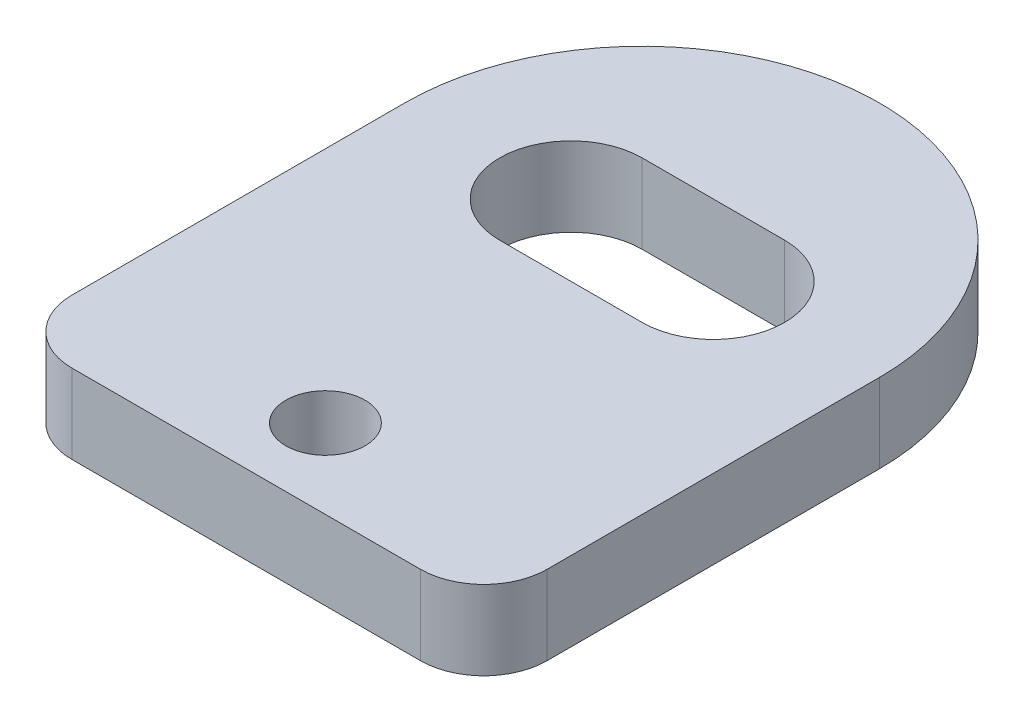
ISO-10303-21;
HEADER;
FILE_DESCRIPTION(('STEP AP214'),'2;1');
FILE_NAME('part.step','',(''),(''),'','','');
FILE_SCHEMA(('AUTOMOTIVE_DESIGN { 1 0 10303 214 1 1 1 1 }'));
ENDSEC;
DATA;
#1=APPLICATION_CONTEXT('core data for automotive mechanical design processes');
#2=APPLICATION_PROTOCOL_DEFINITION('international standard','automotive_design',2000,#1);
#3=PRODUCT_CONTEXT('',#1,'mechanical');
#4=PRODUCT('Part','Part','',(#3));
#5=PRODUCT_RELATED_PRODUCT_CATEGORY('part','',(#4));
#6=PRODUCT_DEFINITION_FORMATION('','',#4);
#7=PRODUCT_DEFINITION_CONTEXT('part definition',#1,'design');
#8=PRODUCT_DEFINITION('design','',#6,#7);
#9=PRODUCT_DEFINITION_SHAPE('','',#8);
#10=(LENGTH_UNIT() NAMED_UNIT(*) SI_UNIT(.MILLI.,.METRE.));
#11=(NAMED_UNIT(*) PLANE_ANGLE_UNIT() SI_UNIT($,.RADIAN.));
#12=(NAMED_UNIT(*) SI_UNIT($,.STERADIAN.) SOLID_ANGLE_UNIT());
#13=UNCERTAINTY_MEASURE_WITH_UNIT(LENGTH_MEASURE(1.E-05),#10,'distance_accuracy_value','');
#14=(GEOMETRIC_REPRESENTATION_CONTEXT(3) GLOBAL_UNCERTAINTY_ASSIGNED_CONTEXT((#13)) GLOBAL_UNIT_ASSIGNED_CONTEXT((#10,
#11,#12)) REPRESENTATION_CONTEXT('',''));
#15=CARTESIAN_POINT('',(0.,0.,0.));
#16=DIRECTION('',(0.,0.,1.));
#17=DIRECTION('',(1.,0.,0.));
#18=AXIS2_PLACEMENT_3D('',#15,#16,#17);
#19=CARTESIAN_POINT('',(19.05,3.175,0.));
#20=DIRECTION('',(-1.,0.,0.));
#21=DIRECTION('',(0.,0.,1.));
#22=AXIS2_PLACEMENT_3D('',#19,#20,#21);
#23=PLANE('',#22);
#24=DIRECTION('',(0.,0.,-1.));
#25=VECTOR('',#24,1.);
#26=CARTESIAN_POINT('',(19.05,3.175,0.));
#27=LINE('',#26,#25);
#28=CARTESIAN_POINT('',(19.05,3.175,20.32));
#29=VERTEX_POINT('',#28);
#30=CARTESIAN_POINT('',(19.05,3.175,-6.35));
#31=VERTEX_POINT('',#30);
#32=EDGE_CURVE('E157',#29,#31,#27,.T.);
#33=ORIENTED_EDGE('',*,*,#32,.F.);
#34=DIRECTION('',(0.,-1.,0.));
#35=VECTOR('',#34,1.);
#36=CARTESIAN_POINT('',(19.05,3.175,20.32));
#37=LINE('',#36,#35);
#38=CARTESIAN_POINT('',(19.05,-3.175,20.32));
#39=VERTEX_POINT('',#38);
#40=EDGE_CURVE('E208',#29,#39,#37,.T.);
#41=ORIENTED_EDGE('',*,*,#40,.T.);
#42=DIRECTION('',(0.,0.,-1.));
#43=VECTOR('',#42,1.);
#44=CARTESIAN_POINT('',(19.05,-3.175,0.));
#45=LINE('',#44,#43);
#46=CARTESIAN_POINT('',(19.05,-3.175,-6.35));
#47=VERTEX_POINT('',#46);
#48=EDGE_CURVE('E188',#39,#47,#45,.T.);
#49=ORIENTED_EDGE('',*,*,#48,.T.);
#50=DIRECTION('',(0.,-1.,0.));
#51=VECTOR('',#50,1.);
#52=CARTESIAN_POINT('',(19.05,3.175,-6.35));
#53=LINE('',#52,#51);
#54=EDGE_CURVE('E204',#31,#47,#53,.T.);
#55=ORIENTED_EDGE('',*,*,#54,.F.);
#56=EDGE_LOOP('',(#33,#41,#49,#55));
#57=FACE_BOUND('',#56,.T.);
#58=ADVANCED_FACE('F41',(#57),#23,.F.);
#59=CARTESIAN_POINT('',(0.,3.175,-6.35));
#60=DIRECTION('',(0.,-1.,0.));
#61=DIRECTION('',(0.,0.,-1.));
#62=AXIS2_PLACEMENT_3D('',#59,#60,#61);
#63=CYLINDRICAL_SURFACE('',#62,19.05);
#64=CARTESIAN_POINT('',(0.,-3.175,-6.35));
#65=DIRECTION('',(0.,1.,0.));
#66=DIRECTION('',(0.,0.,1.));
#67=AXIS2_PLACEMENT_3D('',#64,#65,#66);
#68=CIRCLE('',#67,19.05);
#69=CARTESIAN_POINT('',(-19.05,-3.175,-6.35));
#70=VERTEX_POINT('',#69);
#71=EDGE_CURVE('E191',#47,#70,#68,.T.);
#72=ORIENTED_EDGE('',*,*,#71,.T.);
#73=DIRECTION('',(0.,-1.,0.));
#74=VECTOR('',#73,1.);
#75=CARTESIAN_POINT('',(-19.05,3.175,-6.35));
#76=LINE('',#75,#74);
#77=CARTESIAN_POINT('',(-19.05,3.175,-6.35));
#78=VERTEX_POINT('',#77);
#79=EDGE_CURVE('E131',#78,#70,#76,.T.);
#80=ORIENTED_EDGE('',*,*,#79,.F.);
#81=CARTESIAN_POINT('',(0.,3.175,-6.35));
#82=DIRECTION('',(0.,1.,0.));
#83=DIRECTION('',(0.,0.,1.));
#84=AXIS2_PLACEMENT_3D('',#81,#82,#83);
#85=CIRCLE('',#84,19.05);
#86=EDGE_CURVE('E160',#31,#78,#85,.T.);
#87=ORIENTED_EDGE('',*,*,#86,.F.);
#88=ORIENTED_EDGE('',*,*,#54,.T.);
#89=EDGE_LOOP('',(#72,#80,#87,#88));
#90=FACE_BOUND('',#89,.T.);
#91=ADVANCED_FACE('F254',(#90),#63,.T.);
#92=CARTESIAN_POINT('',(-19.05,3.175,0.));
#93=DIRECTION('',(-1.,0.,0.));
#94=DIRECTION('',(0.,0.,1.));
#95=AXIS2_PLACEMENT_3D('',#92,#93,#94);
#96=PLANE('',#95);
#97=DIRECTION('',(0.,0.,-1.));
#98=VECTOR('',#97,1.);
#99=CARTESIAN_POINT('',(-19.05,-3.175,0.));
#100=LINE('',#99,#98);
#101=CARTESIAN_POINT('',(-19.05,-3.175,20.32));
#102=VERTEX_POINT('',#101);
#103=EDGE_CURVE('E195',#102,#70,#100,.T.);
#104=ORIENTED_EDGE('',*,*,#103,.F.);
#105=DIRECTION('',(0.,-1.,0.));
#106=VECTOR('',#105,1.);
#107=CARTESIAN_POINT('',(-19.05,3.175,20.32));
#108=LINE('',#107,#106);
#109=CARTESIAN_POINT('',(-19.05,3.175,20.32));
#110=VERTEX_POINT('',#109);
#111=EDGE_CURVE('E11',#102,#110,#108,.F.);
#112=ORIENTED_EDGE('',*,*,#111,.T.);
#113=DIRECTION('',(0.,0.,-1.));
#114=VECTOR('',#113,1.);
#115=CARTESIAN_POINT('',(-19.05,3.175,0.));
#116=LINE('',#115,#114);
#117=EDGE_CURVE('E164',#110,#78,#116,.T.);
#118=ORIENTED_EDGE('',*,*,#117,.T.);
#119=ORIENTED_EDGE('',*,*,#79,.T.);
#120=EDGE_LOOP('',(#104,#112,#118,#119));
#121=FACE_BOUND('',#120,.T.);
#122=ADVANCED_FACE('F251',(#121),#96,.T.);
#123=CARTESIAN_POINT('',(5.715,3.175,-6.35));
#124=DIRECTION('',(0.,-1.,0.));
#125=DIRECTION('',(0.,0.,-1.));
#126=AXIS2_PLACEMENT_3D('',#123,#124,#125);
#127=CYLINDRICAL_SURFACE('',#126,5.715);
#128=CARTESIAN_POINT('',(5.715,-3.175,-6.35));
#129=DIRECTION('',(0.,1.,0.));
#130=DIRECTION('',(0.,0.,1.));
#131=AXIS2_PLACEMENT_3D('',#128,#129,#130);
#132=CIRCLE('',#131,5.715);
#133=CARTESIAN_POINT('',(5.715,-3.175,-0.634999999999998));
#134=VERTEX_POINT('',#133);
#135=CARTESIAN_POINT('',(5.715,-3.175,-12.065));
#136=VERTEX_POINT('',#135);
#137=EDGE_CURVE('E125',#134,#136,#132,.T.);
#138=ORIENTED_EDGE('',*,*,#137,.F.);
#139=DIRECTION('',(0.,-1.,0.));
#140=VECTOR('',#139,1.);
#141=CARTESIAN_POINT('',(5.715,3.175,-0.634999999999998));
#142=LINE('',#141,#140);
#143=CARTESIAN_POINT('',(5.715,3.175,-0.634999999999998));
#144=VERTEX_POINT('',#143);
#145=EDGE_CURVE('E120',#144,#134,#142,.T.);
#146=ORIENTED_EDGE('',*,*,#145,.F.);
#147=CARTESIAN_POINT('',(5.715,3.175,-6.35));
#148=DIRECTION('',(0.,1.,0.));
#149=DIRECTION('',(0.,0.,1.));
#150=AXIS2_PLACEMENT_3D('',#147,#148,#149);
#151=CIRCLE('',#150,5.715);
#152=CARTESIAN_POINT('',(5.715,3.175,-12.065));
#153=VERTEX_POINT('',#152);
#154=EDGE_CURVE('E123',#144,#153,#151,.T.);
#155=ORIENTED_EDGE('',*,*,#154,.T.);
#156=DIRECTION('',(0.,-1.,0.));
#157=VECTOR('',#156,1.);
#158=CARTESIAN_POINT('',(5.715,3.175,-12.065));
#159=LINE('',#158,#157);
#160=EDGE_CURVE('E170',#153,#136,#159,.T.);
#161=ORIENTED_EDGE('',*,*,#160,.T.);
#162=EDGE_LOOP('',(#138,#146,#155,#161));
#163=FACE_BOUND('',#162,.T.);
#164=ADVANCED_FACE('F122',(#163),#127,.F.);
#165=CARTESIAN_POINT('',(0.,3.175,-0.634999999999998));
#166=DIRECTION('',(0.,0.,-1.));
#167=DIRECTION('',(-1.,0.,0.));
#168=AXIS2_PLACEMENT_3D('',#165,#166,#167);
#169=PLANE('',#168);
#170=DIRECTION('',(1.,0.,0.));
#171=VECTOR('',#170,1.);
#172=CARTESIAN_POINT('',(0.,-3.175,-0.634999999999998));
#173=LINE('',#172,#171);
#174=CARTESIAN_POINT('',(-5.715,-3.175,-0.634999999999998));
#175=VERTEX_POINT('',#174);
#176=EDGE_CURVE('E177',#175,#134,#173,.T.);
#177=ORIENTED_EDGE('',*,*,#176,.F.);
#178=DIRECTION('',(0.,-1.,0.));
#179=VECTOR('',#178,1.);
#180=CARTESIAN_POINT('',(-5.715,3.175,-0.634999999999998));
#181=LINE('',#180,#179);
#182=CARTESIAN_POINT('',(-5.715,3.175,-0.634999999999998));
#183=VERTEX_POINT('',#182);
#184=EDGE_CURVE('E132',#183,#175,#181,.T.);
#185=ORIENTED_EDGE('',*,*,#184,.F.);
#186=DIRECTION('',(1.,0.,0.));
#187=VECTOR('',#186,1.);
#188=CARTESIAN_POINT('',(0.,3.175,-0.634999999999998));
#189=LINE('',#188,#187);
#190=EDGE_CURVE('E139',#183,#144,#189,.T.);
#191=ORIENTED_EDGE('',*,*,#190,.T.);
#192=ORIENTED_EDGE('',*,*,#145,.T.);
#193=EDGE_LOOP('',(#177,#185,#191,#192));
#194=FACE_BOUND('',#193,.T.);
#195=ADVANCED_FACE('F147',(#194),#169,.T.);
#196=CARTESIAN_POINT('',(-5.715,3.175,-6.35));
#197=DIRECTION('',(0.,-1.,0.));
#198=DIRECTION('',(0.,0.,-1.));
#199=AXIS2_PLACEMENT_3D('',#196,#197,#198);
#200=CYLINDRICAL_SURFACE('',#199,5.715);
#201=CARTESIAN_POINT('',(-5.715,-3.175,-6.35));
#202=DIRECTION('',(0.,1.,0.));
#203=DIRECTION('',(0.,0.,1.));
#204=AXIS2_PLACEMENT_3D('',#201,#202,#203);
#205=CIRCLE('',#204,5.715);
#206=CARTESIAN_POINT('',(-5.715,-3.175,-12.065));
#207=VERTEX_POINT('',#206);
#208=EDGE_CURVE('E180',#207,#175,#205,.T.);
#209=ORIENTED_EDGE('',*,*,#208,.F.);
#210=DIRECTION('',(0.,-1.,0.));
#211=VECTOR('',#210,1.);
#212=CARTESIAN_POINT('',(-5.715,3.175,-12.065));
#213=LINE('',#212,#211);
#214=CARTESIAN_POINT('',(-5.715,3.175,-12.065));
#215=VERTEX_POINT('',#214);
#216=EDGE_CURVE('E211',#215,#207,#213,.T.);
#217=ORIENTED_EDGE('',*,*,#216,.F.);
#218=CARTESIAN_POINT('',(-5.715,3.175,-6.35));
#219=DIRECTION('',(0.,1.,0.));
#220=DIRECTION('',(0.,0.,1.));
#221=AXIS2_PLACEMENT_3D('',#218,#219,#220);
#222=CIRCLE('',#221,5.715);
#223=EDGE_CURVE('E149',#215,#183,#222,.T.);
#224=ORIENTED_EDGE('',*,*,#223,.T.);
#225=ORIENTED_EDGE('',*,*,#184,.T.);
#226=EDGE_LOOP('',(#209,#217,#224,#225));
#227=FACE_BOUND('',#226,.T.);
#228=ADVANCED_FACE('F269',(#227),#200,.F.);
#229=CARTESIAN_POINT('',(0.,3.175,-12.065));
#230=DIRECTION('',(0.,0.,-1.));
#231=DIRECTION('',(-1.,0.,0.));
#232=AXIS2_PLACEMENT_3D('',#229,#230,#231);
#233=PLANE('',#232);
#234=DIRECTION('',(1.,0.,0.));
#235=VECTOR('',#234,1.);
#236=CARTESIAN_POINT('',(0.,-3.175,-12.065));
#237=LINE('',#236,#235);
#238=EDGE_CURVE('E184',#207,#136,#237,.T.);
#239=ORIENTED_EDGE('',*,*,#238,.T.);
#240=ORIENTED_EDGE('',*,*,#160,.F.);
#241=DIRECTION('',(1.,0.,0.));
#242=VECTOR('',#241,1.);
#243=CARTESIAN_POINT('',(0.,3.175,-12.065));
#244=LINE('',#243,#242);
#245=EDGE_CURVE('E142',#215,#153,#244,.T.);
#246=ORIENTED_EDGE('',*,*,#245,.F.);
#247=ORIENTED_EDGE('',*,*,#216,.T.);
#248=EDGE_LOOP('',(#239,#240,#246,#247));
#249=FACE_BOUND('',#248,.T.);
#250=ADVANCED_FACE('F265',(#249),#233,.F.);
#251=CARTESIAN_POINT('',(0.,3.175,19.05));
#252=DIRECTION('',(0.,-1.,0.));
#253=DIRECTION('',(0.,0.,-1.));
#254=AXIS2_PLACEMENT_3D('',#251,#252,#253);
#255=CYLINDRICAL_SURFACE('',#254,3.175);
#256=CARTESIAN_POINT('',(0.,3.175,19.05));
#257=DIRECTION('',(0.,1.,0.));
#258=DIRECTION('',(0.,0.,1.));
#259=AXIS2_PLACEMENT_3D('',#256,#257,#258);
#260=CIRCLE('',#259,3.175);
#261=CARTESIAN_POINT('',(0.,3.175,22.225));
#262=VERTEX_POINT('',#261);
#263=EDGE_CURVE('E145',#262,#262,#260,.T.);
#264=ORIENTED_EDGE('',*,*,#263,.T.);
#265=EDGE_LOOP('',(#264));
#266=FACE_BOUND('',#265,.T.);
#267=CARTESIAN_POINT('',(0.,-3.175,19.05));
#268=DIRECTION('',(0.,1.,0.));
#269=DIRECTION('',(0.,0.,1.));
#270=AXIS2_PLACEMENT_3D('',#267,#268,#269);
#271=CIRCLE('',#270,3.175);
#272=CARTESIAN_POINT('',(0.,-3.175,22.225));
#273=VERTEX_POINT('',#272);
#274=EDGE_CURVE('E171',#273,#273,#271,.T.);
#275=ORIENTED_EDGE('',*,*,#274,.F.);
#276=EDGE_LOOP('',(#275));
#277=FACE_BOUND('',#276,.T.);
#278=ADVANCED_FACE('F268',(#266,#277),#255,.F.);
#279=CARTESIAN_POINT('',(0.,3.175,25.4));
#280=DIRECTION('',(0.,0.,-1.));
#281=DIRECTION('',(-1.,0.,0.));
#282=AXIS2_PLACEMENT_3D('',#279,#280,#281);
#283=PLANE('',#282);
#284=DIRECTION('',(1.,0.,0.));
#285=VECTOR('',#284,1.);
#286=CARTESIAN_POINT('',(0.,-3.175,25.4));
#287=LINE('',#286,#285);
#288=CARTESIAN_POINT('',(-13.97,-3.175,25.4));
#289=VERTEX_POINT('',#288);
#290=CARTESIAN_POINT('',(13.97,-3.175,25.4));
#291=VERTEX_POINT('',#290);
#292=EDGE_CURVE('E198',#289,#291,#287,.T.);
#293=ORIENTED_EDGE('',*,*,#292,.T.);
#294=DIRECTION('',(0.,-1.,0.));
#295=VECTOR('',#294,1.);
#296=CARTESIAN_POINT('',(13.97,3.175,25.4));
#297=LINE('',#296,#295);
#298=CARTESIAN_POINT('',(13.97,3.175,25.4));
#299=VERTEX_POINT('',#298);
#300=EDGE_CURVE('E63',#291,#299,#297,.F.);
#301=ORIENTED_EDGE('',*,*,#300,.T.);
#302=DIRECTION('',(1.,0.,0.));
#303=VECTOR('',#302,1.);
#304=CARTESIAN_POINT('',(0.,3.175,25.4));
#305=LINE('',#304,#303);
#306=CARTESIAN_POINT('',(-13.97,3.175,25.4));
#307=VERTEX_POINT('',#306);
#308=EDGE_CURVE('E167',#307,#299,#305,.T.);
#309=ORIENTED_EDGE('',*,*,#308,.F.);
#310=DIRECTION('',(0.,-1.,0.));
#311=VECTOR('',#310,1.);
#312=CARTESIAN_POINT('',(-13.97,-3.175,25.4));
#313=LINE('',#312,#311);
#314=EDGE_CURVE('E225',#307,#289,#313,.T.);
#315=ORIENTED_EDGE('',*,*,#314,.T.);
#316=EDGE_LOOP('',(#293,#301,#309,#315));
#317=FACE_BOUND('',#316,.T.);
#318=ADVANCED_FACE('F247',(#317),#283,.F.);
#319=CARTESIAN_POINT('',(0.,3.175,0.));
#320=DIRECTION('',(0.,1.,0.));
#321=DIRECTION('',(0.,0.,1.));
#322=AXIS2_PLACEMENT_3D('',#319,#320,#321);
#323=PLANE('',#322);
#324=ORIENTED_EDGE('',*,*,#263,.F.);
#325=EDGE_LOOP('',(#324));
#326=FACE_BOUND('',#325,.T.);
#327=ORIENTED_EDGE('',*,*,#154,.F.);
#328=ORIENTED_EDGE('',*,*,#190,.F.);
#329=ORIENTED_EDGE('',*,*,#223,.F.);
#330=ORIENTED_EDGE('',*,*,#245,.T.);
#331=EDGE_LOOP('',(#327,#328,#329,#330));
#332=FACE_BOUND('',#331,.T.);
#333=ORIENTED_EDGE('',*,*,#308,.T.);
#334=CARTESIAN_POINT('',(13.97,3.175,20.32));
#335=DIRECTION('',(0.,1.,0.));
#336=DIRECTION('',(0.,0.,1.));
#337=AXIS2_PLACEMENT_3D('',#334,#335,#336);
#338=CIRCLE('',#337,5.08);
#339=EDGE_CURVE('E50',#299,#29,#338,.T.);
#340=ORIENTED_EDGE('',*,*,#339,.T.);
#341=ORIENTED_EDGE('',*,*,#32,.T.);
#342=ORIENTED_EDGE('',*,*,#86,.T.);
#343=ORIENTED_EDGE('',*,*,#117,.F.);
#344=CARTESIAN_POINT('',(-13.97,3.175,20.32));
#345=DIRECTION('',(0.,1.,0.));
#346=DIRECTION('',(0.,0.,1.));
#347=AXIS2_PLACEMENT_3D('',#344,#345,#346);
#348=CIRCLE('',#347,5.08);
#349=EDGE_CURVE('E231',#110,#307,#348,.T.);
#350=ORIENTED_EDGE('',*,*,#349,.T.);
#351=EDGE_LOOP('',(#333,#340,#341,#342,#343,#350));
#352=FACE_BOUND('',#351,.T.);
#353=ADVANCED_FACE('F136',(#326,#332,#352),#323,.T.);
#354=CARTESIAN_POINT('',(0.,-3.175,0.));
#355=DIRECTION('',(0.,1.,0.));
#356=DIRECTION('',(0.,0.,1.));
#357=AXIS2_PLACEMENT_3D('',#354,#355,#356);
#358=PLANE('',#357);
#359=ORIENTED_EDGE('',*,*,#274,.T.);
#360=EDGE_LOOP('',(#359));
#361=FACE_BOUND('',#360,.T.);
#362=ORIENTED_EDGE('',*,*,#137,.T.);
#363=ORIENTED_EDGE('',*,*,#238,.F.);
#364=ORIENTED_EDGE('',*,*,#208,.T.);
#365=ORIENTED_EDGE('',*,*,#176,.T.);
#366=EDGE_LOOP('',(#362,#363,#364,#365));
#367=FACE_BOUND('',#366,.T.);
#368=ORIENTED_EDGE('',*,*,#48,.F.);
#369=CARTESIAN_POINT('',(13.97,-3.175,20.32));
#370=DIRECTION('',(0.,1.,0.));
#371=DIRECTION('',(0.,0.,1.));
#372=AXIS2_PLACEMENT_3D('',#369,#370,#371);
#373=CIRCLE('',#372,5.08);
#374=EDGE_CURVE('E222',#39,#291,#373,.F.);
#375=ORIENTED_EDGE('',*,*,#374,.T.);
#376=ORIENTED_EDGE('',*,*,#292,.F.);
#377=CARTESIAN_POINT('',(-13.97,-3.175,20.32));
#378=DIRECTION('',(0.,1.,0.));
#379=DIRECTION('',(0.,0.,1.));
#380=AXIS2_PLACEMENT_3D('',#377,#378,#379);
#381=CIRCLE('',#380,5.08);
#382=EDGE_CURVE('E219',#289,#102,#381,.F.);
#383=ORIENTED_EDGE('',*,*,#382,.T.);
#384=ORIENTED_EDGE('',*,*,#103,.T.);
#385=ORIENTED_EDGE('',*,*,#71,.F.);
#386=EDGE_LOOP('',(#368,#375,#376,#383,#384,#385));
#387=FACE_BOUND('',#386,.T.);
#388=ADVANCED_FACE('F245',(#361,#367,#387),#358,.F.);
#389=CARTESIAN_POINT('',(13.97,3.175,20.32));
#390=DIRECTION('',(0.,-1.,0.));
#391=DIRECTION('',(0.,0.,-1.));
#392=AXIS2_PLACEMENT_3D('',#389,#390,#391);
#393=CYLINDRICAL_SURFACE('',#392,5.08);
#394=ORIENTED_EDGE('',*,*,#339,.F.);
#395=ORIENTED_EDGE('',*,*,#300,.F.);
#396=ORIENTED_EDGE('',*,*,#374,.F.);
#397=ORIENTED_EDGE('',*,*,#40,.F.);
#398=EDGE_LOOP('',(#394,#395,#396,#397));
#399=FACE_BOUND('',#398,.T.);
#400=ADVANCED_FACE('F242',(#399),#393,.T.);
#401=CARTESIAN_POINT('',(-13.97,3.175,20.32));
#402=DIRECTION('',(0.,1.,0.));
#403=DIRECTION('',(0.,0.,1.));
#404=AXIS2_PLACEMENT_3D('',#401,#402,#403);
#405=CYLINDRICAL_SURFACE('',#404,5.08);
#406=ORIENTED_EDGE('',*,*,#349,.F.);
#407=ORIENTED_EDGE('',*,*,#111,.F.);
#408=ORIENTED_EDGE('',*,*,#382,.F.);
#409=ORIENTED_EDGE('',*,*,#314,.F.);
#410=EDGE_LOOP('',(#406,#407,#408,#409));
#411=FACE_BOUND('',#410,.T.);
#412=ADVANCED_FACE('F43',(#411),#405,.T.);
#413=CLOSED_SHELL('',(#58,#91,#122,#164,#195,#228,#250,#278,#318,#353,#388,#400,#412));
#414=MANIFOLD_SOLID_BREP('B2',#413);
#415=ADVANCED_BREP_SHAPE_REPRESENTATION('',(#18,#414),#14);
#416=SHAPE_DEFINITION_REPRESENTATION(#9,#415);
ENDSEC;
END-ISO-10303-21;
